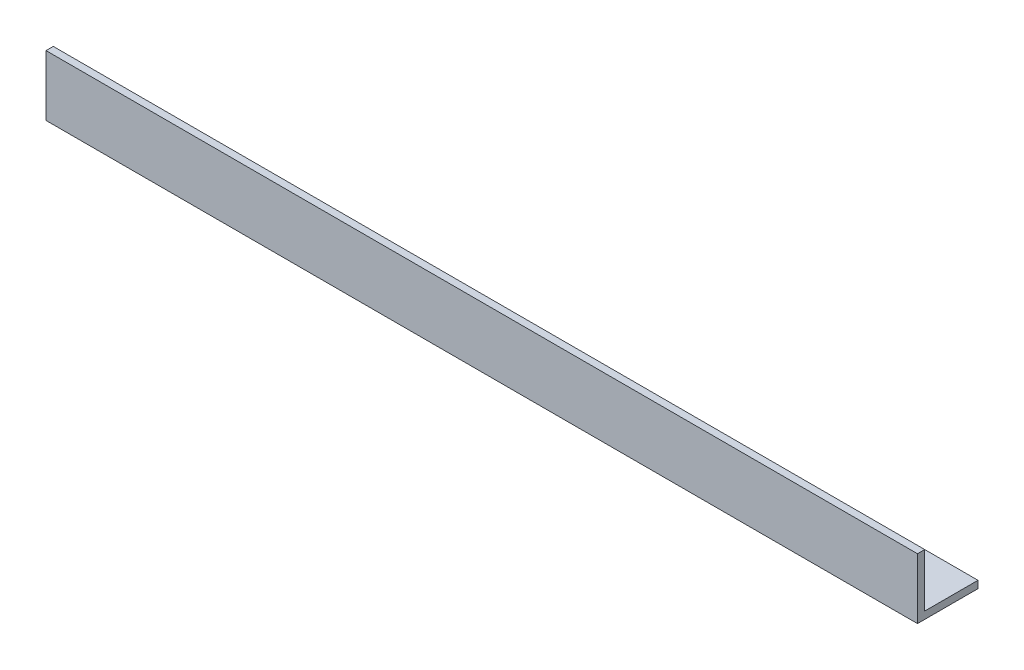
ISO-10303-21;
HEADER;
FILE_DESCRIPTION(('STEP AP214'),'2;1');
FILE_NAME('part.step','',(''),(''),'','','');
FILE_SCHEMA(('AUTOMOTIVE_DESIGN { 1 0 10303 214 1 1 1 1 }'));
ENDSEC;
DATA;
#1=APPLICATION_CONTEXT('core data for automotive mechanical design processes');
#2=APPLICATION_PROTOCOL_DEFINITION('international standard','automotive_design',2000,#1);
#3=PRODUCT_CONTEXT('',#1,'mechanical');
#4=PRODUCT('Part','Part','',(#3));
#5=PRODUCT_RELATED_PRODUCT_CATEGORY('part','',(#4));
#6=PRODUCT_DEFINITION_FORMATION('','',#4);
#7=PRODUCT_DEFINITION_CONTEXT('part definition',#1,'design');
#8=PRODUCT_DEFINITION('design','',#6,#7);
#9=PRODUCT_DEFINITION_SHAPE('','',#8);
#10=(LENGTH_UNIT() NAMED_UNIT(*) SI_UNIT(.MILLI.,.METRE.));
#11=(NAMED_UNIT(*) PLANE_ANGLE_UNIT() SI_UNIT($,.RADIAN.));
#12=(NAMED_UNIT(*) SI_UNIT($,.STERADIAN.) SOLID_ANGLE_UNIT());
#13=UNCERTAINTY_MEASURE_WITH_UNIT(LENGTH_MEASURE(1.E-05),#10,'distance_accuracy_value','');
#14=(GEOMETRIC_REPRESENTATION_CONTEXT(3) GLOBAL_UNCERTAINTY_ASSIGNED_CONTEXT((#13)) GLOBAL_UNIT_ASSIGNED_CONTEXT((#10,
#11,#12)) REPRESENTATION_CONTEXT('',''));
#15=CARTESIAN_POINT('',(0.,0.,0.));
#16=DIRECTION('',(0.,0.,1.));
#17=DIRECTION('',(1.,0.,0.));
#18=AXIS2_PLACEMENT_3D('',#15,#16,#17);
#19=CARTESIAN_POINT('',(180.,22.,2.99999999999993));
#20=DIRECTION('',(0.,-1.,0.));
#21=DIRECTION('',(0.,0.,-1.));
#22=AXIS2_PLACEMENT_3D('',#19,#20,#21);
#23=PLANE('',#22);
#24=DIRECTION('',(0.,0.,1.));
#25=VECTOR('',#24,1.);
#26=CARTESIAN_POINT('',(-180.,22.,2.99999999999993));
#27=LINE('',#26,#25);
#28=CARTESIAN_POINT('',(-180.,22.,0.));
#29=VERTEX_POINT('',#28);
#30=CARTESIAN_POINT('',(-180.,22.,2.99999999999993));
#31=VERTEX_POINT('',#30);
#32=EDGE_CURVE('E121',#29,#31,#27,.T.);
#33=ORIENTED_EDGE('',*,*,#32,.T.);
#34=DIRECTION('',(-1.,0.,0.));
#35=VECTOR('',#34,1.);
#36=CARTESIAN_POINT('',(180.,22.,2.99999999999993));
#37=LINE('',#36,#35);
#38=CARTESIAN_POINT('',(180.,22.,2.99999999999993));
#39=VERTEX_POINT('',#38);
#40=EDGE_CURVE('E11',#39,#31,#37,.T.);
#41=ORIENTED_EDGE('',*,*,#40,.F.);
#42=DIRECTION('',(0.,0.,1.));
#43=VECTOR('',#42,1.);
#44=CARTESIAN_POINT('',(180.,22.,2.99999999999993));
#45=LINE('',#44,#43);
#46=CARTESIAN_POINT('',(180.,22.,0.));
#47=VERTEX_POINT('',#46);
#48=EDGE_CURVE('E131',#47,#39,#45,.T.);
#49=ORIENTED_EDGE('',*,*,#48,.F.);
#50=DIRECTION('',(-1.,0.,0.));
#51=VECTOR('',#50,1.);
#52=CARTESIAN_POINT('',(180.,22.,0.));
#53=LINE('',#52,#51);
#54=EDGE_CURVE('E117',#47,#29,#53,.T.);
#55=ORIENTED_EDGE('',*,*,#54,.T.);
#56=EDGE_LOOP('',(#33,#41,#49,#55));
#57=FACE_BOUND('',#56,.T.);
#58=ADVANCED_FACE('F35',(#57),#23,.F.);
#59=CARTESIAN_POINT('',(180.,-3.00000000000004,3.));
#60=DIRECTION('',(0.,0.,-1.));
#61=DIRECTION('',(0.,1.,0.));
#62=AXIS2_PLACEMENT_3D('',#59,#60,#61);
#63=PLANE('',#62);
#64=DIRECTION('',(0.,-1.,0.));
#65=VECTOR('',#64,1.);
#66=CARTESIAN_POINT('',(-180.,-3.00000000000004,3.));
#67=LINE('',#66,#65);
#68=CARTESIAN_POINT('',(-180.,-3.00000000000004,3.));
#69=VERTEX_POINT('',#68);
#70=EDGE_CURVE('E124',#31,#69,#67,.T.);
#71=ORIENTED_EDGE('',*,*,#70,.T.);
#72=DIRECTION('',(-1.,0.,0.));
#73=VECTOR('',#72,1.);
#74=CARTESIAN_POINT('',(180.,-3.00000000000004,3.));
#75=LINE('',#74,#73);
#76=CARTESIAN_POINT('',(180.,-3.00000000000004,3.));
#77=VERTEX_POINT('',#76);
#78=EDGE_CURVE('E44',#77,#69,#75,.T.);
#79=ORIENTED_EDGE('',*,*,#78,.F.);
#80=DIRECTION('',(0.,-1.,0.));
#81=VECTOR('',#80,1.);
#82=CARTESIAN_POINT('',(180.,-3.00000000000004,3.));
#83=LINE('',#82,#81);
#84=EDGE_CURVE('E90',#39,#77,#83,.T.);
#85=ORIENTED_EDGE('',*,*,#84,.F.);
#86=ORIENTED_EDGE('',*,*,#40,.T.);
#87=EDGE_LOOP('',(#71,#79,#85,#86));
#88=FACE_BOUND('',#87,.T.);
#89=ADVANCED_FACE('F179',(#88),#63,.F.);
#90=CARTESIAN_POINT('',(180.,-3.,-22.));
#91=DIRECTION('',(0.,1.,0.));
#92=DIRECTION('',(0.,0.,1.));
#93=AXIS2_PLACEMENT_3D('',#90,#91,#92);
#94=PLANE('',#93);
#95=CARTESIAN_POINT('',(-160.,-3.00000000000004,-11.));
#96=DIRECTION('',(0.,1.,0.));
#97=DIRECTION('',(0.,0.,1.));
#98=AXIS2_PLACEMENT_3D('',#95,#96,#97);
#99=CIRCLE('',#98,2.75000000000001);
#100=CARTESIAN_POINT('',(-160.,-3.00000000000004,-8.25));
#101=VERTEX_POINT('',#100);
#102=EDGE_CURVE('E141',#101,#101,#99,.T.);
#103=ORIENTED_EDGE('',*,*,#102,.T.);
#104=EDGE_LOOP('',(#103));
#105=FACE_BOUND('',#104,.T.);
#106=CARTESIAN_POINT('',(-120.,-3.00000000000004,-11.));
#107=DIRECTION('',(0.,1.,0.));
#108=DIRECTION('',(0.,0.,1.));
#109=AXIS2_PLACEMENT_3D('',#106,#107,#108);
#110=CIRCLE('',#109,2.75000000000001);
#111=CARTESIAN_POINT('',(-120.,-3.00000000000004,-8.25));
#112=VERTEX_POINT('',#111);
#113=EDGE_CURVE('E216',#112,#112,#110,.T.);
#114=ORIENTED_EDGE('',*,*,#113,.T.);
#115=EDGE_LOOP('',(#114));
#116=FACE_BOUND('',#115,.T.);
#117=CARTESIAN_POINT('',(-80.,-3.00000000000004,-11.));
#118=DIRECTION('',(0.,1.,0.));
#119=DIRECTION('',(0.,0.,1.));
#120=AXIS2_PLACEMENT_3D('',#117,#118,#119);
#121=CIRCLE('',#120,2.75000000000001);
#122=CARTESIAN_POINT('',(-80.,-3.00000000000004,-8.25));
#123=VERTEX_POINT('',#122);
#124=EDGE_CURVE('E213',#123,#123,#121,.T.);
#125=ORIENTED_EDGE('',*,*,#124,.T.);
#126=EDGE_LOOP('',(#125));
#127=FACE_BOUND('',#126,.T.);
#128=CARTESIAN_POINT('',(-40.,-3.00000000000004,-11.));
#129=DIRECTION('',(0.,1.,0.));
#130=DIRECTION('',(0.,0.,1.));
#131=AXIS2_PLACEMENT_3D('',#128,#129,#130);
#132=CIRCLE('',#131,2.75000000000001);
#133=CARTESIAN_POINT('',(-40.,-3.00000000000004,-8.25));
#134=VERTEX_POINT('',#133);
#135=EDGE_CURVE('E210',#134,#134,#132,.T.);
#136=ORIENTED_EDGE('',*,*,#135,.T.);
#137=EDGE_LOOP('',(#136));
#138=FACE_BOUND('',#137,.T.);
#139=CARTESIAN_POINT('',(0.,-3.00000000000004,-11.));
#140=DIRECTION('',(0.,1.,0.));
#141=DIRECTION('',(0.,0.,1.));
#142=AXIS2_PLACEMENT_3D('',#139,#140,#141);
#143=CIRCLE('',#142,2.75000000000001);
#144=CARTESIAN_POINT('',(0.,-3.00000000000004,-8.25));
#145=VERTEX_POINT('',#144);
#146=EDGE_CURVE('E207',#145,#145,#143,.T.);
#147=ORIENTED_EDGE('',*,*,#146,.T.);
#148=EDGE_LOOP('',(#147));
#149=FACE_BOUND('',#148,.T.);
#150=CARTESIAN_POINT('',(40.,-3.00000000000004,-11.));
#151=DIRECTION('',(0.,1.,0.));
#152=DIRECTION('',(0.,0.,1.));
#153=AXIS2_PLACEMENT_3D('',#150,#151,#152);
#154=CIRCLE('',#153,2.75000000000001);
#155=CARTESIAN_POINT('',(40.,-3.00000000000004,-8.25));
#156=VERTEX_POINT('',#155);
#157=EDGE_CURVE('E204',#156,#156,#154,.T.);
#158=ORIENTED_EDGE('',*,*,#157,.T.);
#159=EDGE_LOOP('',(#158));
#160=FACE_BOUND('',#159,.T.);
#161=CARTESIAN_POINT('',(80.,-3.00000000000004,-11.));
#162=DIRECTION('',(0.,1.,0.));
#163=DIRECTION('',(0.,0.,1.));
#164=AXIS2_PLACEMENT_3D('',#161,#162,#163);
#165=CIRCLE('',#164,2.75000000000001);
#166=CARTESIAN_POINT('',(80.,-3.00000000000004,-8.25));
#167=VERTEX_POINT('',#166);
#168=EDGE_CURVE('E201',#167,#167,#165,.T.);
#169=ORIENTED_EDGE('',*,*,#168,.T.);
#170=EDGE_LOOP('',(#169));
#171=FACE_BOUND('',#170,.T.);
#172=CARTESIAN_POINT('',(120.,-3.00000000000004,-11.));
#173=DIRECTION('',(0.,1.,0.));
#174=DIRECTION('',(0.,0.,1.));
#175=AXIS2_PLACEMENT_3D('',#172,#173,#174);
#176=CIRCLE('',#175,2.75000000000001);
#177=CARTESIAN_POINT('',(120.,-3.00000000000004,-8.25));
#178=VERTEX_POINT('',#177);
#179=EDGE_CURVE('E198',#178,#178,#176,.T.);
#180=ORIENTED_EDGE('',*,*,#179,.T.);
#181=EDGE_LOOP('',(#180));
#182=FACE_BOUND('',#181,.T.);
#183=CARTESIAN_POINT('',(160.,-3.00000000000004,-11.));
#184=DIRECTION('',(0.,1.,0.));
#185=DIRECTION('',(0.,0.,1.));
#186=AXIS2_PLACEMENT_3D('',#183,#184,#185);
#187=CIRCLE('',#186,2.75000000000001);
#188=CARTESIAN_POINT('',(160.,-3.00000000000004,-8.25));
#189=VERTEX_POINT('',#188);
#190=EDGE_CURVE('E195',#189,#189,#187,.T.);
#191=ORIENTED_EDGE('',*,*,#190,.T.);
#192=EDGE_LOOP('',(#191));
#193=FACE_BOUND('',#192,.T.);
#194=DIRECTION('',(0.,0.,-1.));
#195=VECTOR('',#194,1.);
#196=CARTESIAN_POINT('',(-180.,-3.,-22.));
#197=LINE('',#196,#195);
#198=CARTESIAN_POINT('',(-180.,-3.,-22.));
#199=VERTEX_POINT('',#198);
#200=EDGE_CURVE('E126',#69,#199,#197,.T.);
#201=ORIENTED_EDGE('',*,*,#200,.T.);
#202=DIRECTION('',(-1.,0.,0.));
#203=VECTOR('',#202,1.);
#204=CARTESIAN_POINT('',(180.,-3.,-22.));
#205=LINE('',#204,#203);
#206=CARTESIAN_POINT('',(180.,-3.,-22.));
#207=VERTEX_POINT('',#206);
#208=EDGE_CURVE('E112',#207,#199,#205,.T.);
#209=ORIENTED_EDGE('',*,*,#208,.F.);
#210=DIRECTION('',(0.,0.,-1.));
#211=VECTOR('',#210,1.);
#212=CARTESIAN_POINT('',(180.,-3.,-22.));
#213=LINE('',#212,#211);
#214=EDGE_CURVE('E103',#77,#207,#213,.T.);
#215=ORIENTED_EDGE('',*,*,#214,.F.);
#216=ORIENTED_EDGE('',*,*,#78,.T.);
#217=EDGE_LOOP('',(#201,#209,#215,#216));
#218=FACE_BOUND('',#217,.T.);
#219=ADVANCED_FACE('F184',(#105,#116,#127,#138,#149,#160,#171,#182,#193,#218),#94,.F.);
#220=CARTESIAN_POINT('',(180.,0.,-22.));
#221=DIRECTION('',(0.,0.,1.));
#222=DIRECTION('',(1.,0.,0.));
#223=AXIS2_PLACEMENT_3D('',#220,#221,#222);
#224=PLANE('',#223);
#225=DIRECTION('',(0.,1.,0.));
#226=VECTOR('',#225,1.);
#227=CARTESIAN_POINT('',(-180.,0.,-22.));
#228=LINE('',#227,#226);
#229=CARTESIAN_POINT('',(-180.,0.,-22.));
#230=VERTEX_POINT('',#229);
#231=EDGE_CURVE('E111',#199,#230,#228,.T.);
#232=ORIENTED_EDGE('',*,*,#231,.T.);
#233=DIRECTION('',(-1.,0.,0.));
#234=VECTOR('',#233,1.);
#235=CARTESIAN_POINT('',(180.,0.,-22.));
#236=LINE('',#235,#234);
#237=CARTESIAN_POINT('',(180.,0.,-22.));
#238=VERTEX_POINT('',#237);
#239=EDGE_CURVE('E108',#238,#230,#236,.T.);
#240=ORIENTED_EDGE('',*,*,#239,.F.);
#241=DIRECTION('',(0.,1.,0.));
#242=VECTOR('',#241,1.);
#243=CARTESIAN_POINT('',(180.,0.,-22.));
#244=LINE('',#243,#242);
#245=EDGE_CURVE('E97',#207,#238,#244,.T.);
#246=ORIENTED_EDGE('',*,*,#245,.F.);
#247=ORIENTED_EDGE('',*,*,#208,.T.);
#248=EDGE_LOOP('',(#232,#240,#246,#247));
#249=FACE_BOUND('',#248,.T.);
#250=ADVANCED_FACE('F109',(#249),#224,.F.);
#251=CARTESIAN_POINT('',(180.,0.,0.));
#252=DIRECTION('',(0.,-1.,0.));
#253=DIRECTION('',(0.,0.,-1.));
#254=AXIS2_PLACEMENT_3D('',#251,#252,#253);
#255=PLANE('',#254);
#256=CARTESIAN_POINT('',(-160.,0.,-11.));
#257=DIRECTION('',(0.,-1.,0.));
#258=DIRECTION('',(0.,0.,-1.));
#259=AXIS2_PLACEMENT_3D('',#256,#257,#258);
#260=CIRCLE('',#259,2.75000000000001);
#261=CARTESIAN_POINT('',(-160.,0.,-13.75));
#262=VERTEX_POINT('',#261);
#263=EDGE_CURVE('E38',#262,#262,#260,.T.);
#264=ORIENTED_EDGE('',*,*,#263,.T.);
#265=EDGE_LOOP('',(#264));
#266=FACE_BOUND('',#265,.T.);
#267=CARTESIAN_POINT('',(-120.,0.,-11.));
#268=DIRECTION('',(0.,-1.,0.));
#269=DIRECTION('',(0.,0.,-1.));
#270=AXIS2_PLACEMENT_3D('',#267,#268,#269);
#271=CIRCLE('',#270,2.75000000000001);
#272=CARTESIAN_POINT('',(-120.,0.,-13.75));
#273=VERTEX_POINT('',#272);
#274=EDGE_CURVE('E158',#273,#273,#271,.T.);
#275=ORIENTED_EDGE('',*,*,#274,.T.);
#276=EDGE_LOOP('',(#275));
#277=FACE_BOUND('',#276,.T.);
#278=CARTESIAN_POINT('',(-80.,0.,-11.));
#279=DIRECTION('',(0.,-1.,0.));
#280=DIRECTION('',(0.,0.,-1.));
#281=AXIS2_PLACEMENT_3D('',#278,#279,#280);
#282=CIRCLE('',#281,2.75000000000001);
#283=CARTESIAN_POINT('',(-80.,0.,-13.75));
#284=VERTEX_POINT('',#283);
#285=EDGE_CURVE('E156',#284,#284,#282,.T.);
#286=ORIENTED_EDGE('',*,*,#285,.T.);
#287=EDGE_LOOP('',(#286));
#288=FACE_BOUND('',#287,.T.);
#289=CARTESIAN_POINT('',(-40.,0.,-11.));
#290=DIRECTION('',(0.,-1.,0.));
#291=DIRECTION('',(0.,0.,-1.));
#292=AXIS2_PLACEMENT_3D('',#289,#290,#291);
#293=CIRCLE('',#292,2.75000000000001);
#294=CARTESIAN_POINT('',(-40.,0.,-13.75));
#295=VERTEX_POINT('',#294);
#296=EDGE_CURVE('E153',#295,#295,#293,.T.);
#297=ORIENTED_EDGE('',*,*,#296,.T.);
#298=EDGE_LOOP('',(#297));
#299=FACE_BOUND('',#298,.T.);
#300=CARTESIAN_POINT('',(0.,0.,-11.));
#301=DIRECTION('',(0.,-1.,0.));
#302=DIRECTION('',(0.,0.,-1.));
#303=AXIS2_PLACEMENT_3D('',#300,#301,#302);
#304=CIRCLE('',#303,2.75000000000001);
#305=CARTESIAN_POINT('',(0.,0.,-13.75));
#306=VERTEX_POINT('',#305);
#307=EDGE_CURVE('E150',#306,#306,#304,.T.);
#308=ORIENTED_EDGE('',*,*,#307,.T.);
#309=EDGE_LOOP('',(#308));
#310=FACE_BOUND('',#309,.T.);
#311=CARTESIAN_POINT('',(40.,0.,-11.));
#312=DIRECTION('',(0.,-1.,0.));
#313=DIRECTION('',(0.,0.,-1.));
#314=AXIS2_PLACEMENT_3D('',#311,#312,#313);
#315=CIRCLE('',#314,2.75000000000001);
#316=CARTESIAN_POINT('',(40.,0.,-13.75));
#317=VERTEX_POINT('',#316);
#318=EDGE_CURVE('E147',#317,#317,#315,.T.);
#319=ORIENTED_EDGE('',*,*,#318,.T.);
#320=EDGE_LOOP('',(#319));
#321=FACE_BOUND('',#320,.T.);
#322=CARTESIAN_POINT('',(80.,0.,-11.));
#323=DIRECTION('',(0.,-1.,0.));
#324=DIRECTION('',(0.,0.,-1.));
#325=AXIS2_PLACEMENT_3D('',#322,#323,#324);
#326=CIRCLE('',#325,2.75000000000001);
#327=CARTESIAN_POINT('',(80.,0.,-13.75));
#328=VERTEX_POINT('',#327);
#329=EDGE_CURVE('E144',#328,#328,#326,.T.);
#330=ORIENTED_EDGE('',*,*,#329,.T.);
#331=EDGE_LOOP('',(#330));
#332=FACE_BOUND('',#331,.T.);
#333=CARTESIAN_POINT('',(120.,0.,-11.));
#334=DIRECTION('',(0.,-1.,0.));
#335=DIRECTION('',(0.,0.,-1.));
#336=AXIS2_PLACEMENT_3D('',#333,#334,#335);
#337=CIRCLE('',#336,2.75000000000001);
#338=CARTESIAN_POINT('',(120.,0.,-13.75));
#339=VERTEX_POINT('',#338);
#340=EDGE_CURVE('E140',#339,#339,#337,.T.);
#341=ORIENTED_EDGE('',*,*,#340,.T.);
#342=EDGE_LOOP('',(#341));
#343=FACE_BOUND('',#342,.T.);
#344=CARTESIAN_POINT('',(160.,0.,-11.));
#345=DIRECTION('',(0.,-1.,0.));
#346=DIRECTION('',(0.,0.,-1.));
#347=AXIS2_PLACEMENT_3D('',#344,#345,#346);
#348=CIRCLE('',#347,2.75000000000001);
#349=CARTESIAN_POINT('',(160.,0.,-13.75));
#350=VERTEX_POINT('',#349);
#351=EDGE_CURVE('E137',#350,#350,#348,.T.);
#352=ORIENTED_EDGE('',*,*,#351,.T.);
#353=EDGE_LOOP('',(#352));
#354=FACE_BOUND('',#353,.T.);
#355=DIRECTION('',(0.,0.,1.));
#356=VECTOR('',#355,1.);
#357=CARTESIAN_POINT('',(-180.,0.,0.));
#358=LINE('',#357,#356);
#359=CARTESIAN_POINT('',(-180.,0.,0.));
#360=VERTEX_POINT('',#359);
#361=EDGE_CURVE('E76',#230,#360,#358,.T.);
#362=ORIENTED_EDGE('',*,*,#361,.T.);
#363=DIRECTION('',(-1.,0.,0.));
#364=VECTOR('',#363,1.);
#365=CARTESIAN_POINT('',(180.,0.,0.));
#366=LINE('',#365,#364);
#367=CARTESIAN_POINT('',(180.,0.,0.));
#368=VERTEX_POINT('',#367);
#369=EDGE_CURVE('E113',#368,#360,#366,.T.);
#370=ORIENTED_EDGE('',*,*,#369,.F.);
#371=DIRECTION('',(0.,0.,1.));
#372=VECTOR('',#371,1.);
#373=CARTESIAN_POINT('',(180.,0.,0.));
#374=LINE('',#373,#372);
#375=EDGE_CURVE('E101',#238,#368,#374,.T.);
#376=ORIENTED_EDGE('',*,*,#375,.F.);
#377=ORIENTED_EDGE('',*,*,#239,.T.);
#378=EDGE_LOOP('',(#362,#370,#376,#377));
#379=FACE_BOUND('',#378,.T.);
#380=ADVANCED_FACE('F115',(#266,#277,#288,#299,#310,#321,#332,#343,#354,#379),#255,.F.);
#381=CARTESIAN_POINT('',(180.,22.,0.));
#382=DIRECTION('',(0.,0.,1.));
#383=DIRECTION('',(0.,-1.,0.));
#384=AXIS2_PLACEMENT_3D('',#381,#382,#383);
#385=PLANE('',#384);
#386=DIRECTION('',(0.,1.,0.));
#387=VECTOR('',#386,1.);
#388=CARTESIAN_POINT('',(-180.,22.,0.));
#389=LINE('',#388,#387);
#390=EDGE_CURVE('E82',#360,#29,#389,.T.);
#391=ORIENTED_EDGE('',*,*,#390,.T.);
#392=ORIENTED_EDGE('',*,*,#54,.F.);
#393=DIRECTION('',(0.,1.,0.));
#394=VECTOR('',#393,1.);
#395=CARTESIAN_POINT('',(180.,22.,0.));
#396=LINE('',#395,#394);
#397=EDGE_CURVE('E53',#368,#47,#396,.T.);
#398=ORIENTED_EDGE('',*,*,#397,.F.);
#399=ORIENTED_EDGE('',*,*,#369,.T.);
#400=EDGE_LOOP('',(#391,#392,#398,#399));
#401=FACE_BOUND('',#400,.T.);
#402=ADVANCED_FACE('F248',(#401),#385,.F.);
#403=CARTESIAN_POINT('',(180.,0.,0.));
#404=DIRECTION('',(-1.,0.,0.));
#405=DIRECTION('',(0.,0.,1.));
#406=AXIS2_PLACEMENT_3D('',#403,#404,#405);
#407=PLANE('',#406);
#408=ORIENTED_EDGE('',*,*,#48,.T.);
#409=ORIENTED_EDGE('',*,*,#84,.T.);
#410=ORIENTED_EDGE('',*,*,#214,.T.);
#411=ORIENTED_EDGE('',*,*,#245,.T.);
#412=ORIENTED_EDGE('',*,*,#375,.T.);
#413=ORIENTED_EDGE('',*,*,#397,.T.);
#414=EDGE_LOOP('',(#408,#409,#410,#411,#412,#413));
#415=FACE_BOUND('',#414,.T.);
#416=ADVANCED_FACE('F99',(#415),#407,.F.);
#417=CARTESIAN_POINT('',(-180.,0.,0.));
#418=DIRECTION('',(-1.,0.,0.));
#419=DIRECTION('',(0.,0.,1.));
#420=AXIS2_PLACEMENT_3D('',#417,#418,#419);
#421=PLANE('',#420);
#422=ORIENTED_EDGE('',*,*,#32,.F.);
#423=ORIENTED_EDGE('',*,*,#390,.F.);
#424=ORIENTED_EDGE('',*,*,#361,.F.);
#425=ORIENTED_EDGE('',*,*,#231,.F.);
#426=ORIENTED_EDGE('',*,*,#200,.F.);
#427=ORIENTED_EDGE('',*,*,#70,.F.);
#428=EDGE_LOOP('',(#422,#423,#424,#425,#426,#427));
#429=FACE_BOUND('',#428,.T.);
#430=ADVANCED_FACE('F189',(#429),#421,.T.);
#431=CARTESIAN_POINT('',(160.,-3.00000000000004,-11.));
#432=DIRECTION('',(0.,1.,0.));
#433=DIRECTION('',(0.,0.,1.));
#434=AXIS2_PLACEMENT_3D('',#431,#432,#433);
#435=CYLINDRICAL_SURFACE('',#434,2.75000000000001);
#436=ORIENTED_EDGE('',*,*,#190,.F.);
#437=EDGE_LOOP('',(#436));
#438=FACE_BOUND('',#437,.T.);
#439=ORIENTED_EDGE('',*,*,#351,.F.);
#440=EDGE_LOOP('',(#439));
#441=FACE_BOUND('',#440,.T.);
#442=ADVANCED_FACE('F240',(#438,#441),#435,.F.);
#443=CARTESIAN_POINT('',(120.,-3.00000000000004,-11.));
#444=DIRECTION('',(0.,1.,0.));
#445=DIRECTION('',(0.,0.,1.));
#446=AXIS2_PLACEMENT_3D('',#443,#444,#445);
#447=CYLINDRICAL_SURFACE('',#446,2.75000000000001);
#448=ORIENTED_EDGE('',*,*,#179,.F.);
#449=EDGE_LOOP('',(#448));
#450=FACE_BOUND('',#449,.T.);
#451=ORIENTED_EDGE('',*,*,#340,.F.);
#452=EDGE_LOOP('',(#451));
#453=FACE_BOUND('',#452,.T.);
#454=ADVANCED_FACE('F243',(#450,#453),#447,.F.);
#455=CARTESIAN_POINT('',(80.,-3.00000000000004,-11.));
#456=DIRECTION('',(0.,1.,0.));
#457=DIRECTION('',(0.,0.,1.));
#458=AXIS2_PLACEMENT_3D('',#455,#456,#457);
#459=CYLINDRICAL_SURFACE('',#458,2.75000000000001);
#460=ORIENTED_EDGE('',*,*,#168,.F.);
#461=EDGE_LOOP('',(#460));
#462=FACE_BOUND('',#461,.T.);
#463=ORIENTED_EDGE('',*,*,#329,.F.);
#464=EDGE_LOOP('',(#463));
#465=FACE_BOUND('',#464,.T.);
#466=ADVANCED_FACE('F264',(#462,#465),#459,.F.);
#467=CARTESIAN_POINT('',(40.,-3.00000000000004,-11.));
#468=DIRECTION('',(0.,1.,0.));
#469=DIRECTION('',(0.,0.,1.));
#470=AXIS2_PLACEMENT_3D('',#467,#468,#469);
#471=CYLINDRICAL_SURFACE('',#470,2.75000000000001);
#472=ORIENTED_EDGE('',*,*,#157,.F.);
#473=EDGE_LOOP('',(#472));
#474=FACE_BOUND('',#473,.T.);
#475=ORIENTED_EDGE('',*,*,#318,.F.);
#476=EDGE_LOOP('',(#475));
#477=FACE_BOUND('',#476,.T.);
#478=ADVANCED_FACE('F268',(#474,#477),#471,.F.);
#479=CARTESIAN_POINT('',(0.,-3.00000000000004,-11.));
#480=DIRECTION('',(0.,1.,0.));
#481=DIRECTION('',(0.,0.,1.));
#482=AXIS2_PLACEMENT_3D('',#479,#480,#481);
#483=CYLINDRICAL_SURFACE('',#482,2.75000000000001);
#484=ORIENTED_EDGE('',*,*,#146,.F.);
#485=EDGE_LOOP('',(#484));
#486=FACE_BOUND('',#485,.T.);
#487=ORIENTED_EDGE('',*,*,#307,.F.);
#488=EDGE_LOOP('',(#487));
#489=FACE_BOUND('',#488,.T.);
#490=ADVANCED_FACE('F272',(#486,#489),#483,.F.);
#491=CARTESIAN_POINT('',(-40.,-3.00000000000004,-11.));
#492=DIRECTION('',(0.,1.,0.));
#493=DIRECTION('',(0.,0.,1.));
#494=AXIS2_PLACEMENT_3D('',#491,#492,#493);
#495=CYLINDRICAL_SURFACE('',#494,2.75000000000001);
#496=ORIENTED_EDGE('',*,*,#135,.F.);
#497=EDGE_LOOP('',(#496));
#498=FACE_BOUND('',#497,.T.);
#499=ORIENTED_EDGE('',*,*,#296,.F.);
#500=EDGE_LOOP('',(#499));
#501=FACE_BOUND('',#500,.T.);
#502=ADVANCED_FACE('F276',(#498,#501),#495,.F.);
#503=CARTESIAN_POINT('',(-80.,-3.00000000000004,-11.));
#504=DIRECTION('',(0.,1.,0.));
#505=DIRECTION('',(0.,0.,1.));
#506=AXIS2_PLACEMENT_3D('',#503,#504,#505);
#507=CYLINDRICAL_SURFACE('',#506,2.75000000000001);
#508=ORIENTED_EDGE('',*,*,#124,.F.);
#509=EDGE_LOOP('',(#508));
#510=FACE_BOUND('',#509,.T.);
#511=ORIENTED_EDGE('',*,*,#285,.F.);
#512=EDGE_LOOP('',(#511));
#513=FACE_BOUND('',#512,.T.);
#514=ADVANCED_FACE('F174',(#510,#513),#507,.F.);
#515=CARTESIAN_POINT('',(-120.,-3.00000000000004,-11.));
#516=DIRECTION('',(0.,1.,0.));
#517=DIRECTION('',(0.,0.,1.));
#518=AXIS2_PLACEMENT_3D('',#515,#516,#517);
#519=CYLINDRICAL_SURFACE('',#518,2.75000000000001);
#520=ORIENTED_EDGE('',*,*,#113,.F.);
#521=EDGE_LOOP('',(#520));
#522=FACE_BOUND('',#521,.T.);
#523=ORIENTED_EDGE('',*,*,#274,.F.);
#524=EDGE_LOOP('',(#523));
#525=FACE_BOUND('',#524,.T.);
#526=ADVANCED_FACE('F168',(#522,#525),#519,.F.);
#527=CARTESIAN_POINT('',(-160.,-3.00000000000004,-11.));
#528=DIRECTION('',(0.,1.,0.));
#529=DIRECTION('',(0.,0.,1.));
#530=AXIS2_PLACEMENT_3D('',#527,#528,#529);
#531=CYLINDRICAL_SURFACE('',#530,2.75000000000001);
#532=ORIENTED_EDGE('',*,*,#102,.F.);
#533=EDGE_LOOP('',(#532));
#534=FACE_BOUND('',#533,.T.);
#535=ORIENTED_EDGE('',*,*,#263,.F.);
#536=EDGE_LOOP('',(#535));
#537=FACE_BOUND('',#536,.T.);
#538=ADVANCED_FACE('F166',(#534,#537),#531,.F.);
#539=CLOSED_SHELL('',(#58,#89,#219,#250,#380,#402,#416,#430,#442,#454,#466,#478,#490,#502,#514,
#526,#538));
#540=MANIFOLD_SOLID_BREP('B2',#539);
#541=ADVANCED_BREP_SHAPE_REPRESENTATION('',(#18,#540),#14);
#542=SHAPE_DEFINITION_REPRESENTATION(#9,#541);
ENDSEC;
END-ISO-10303-21;
